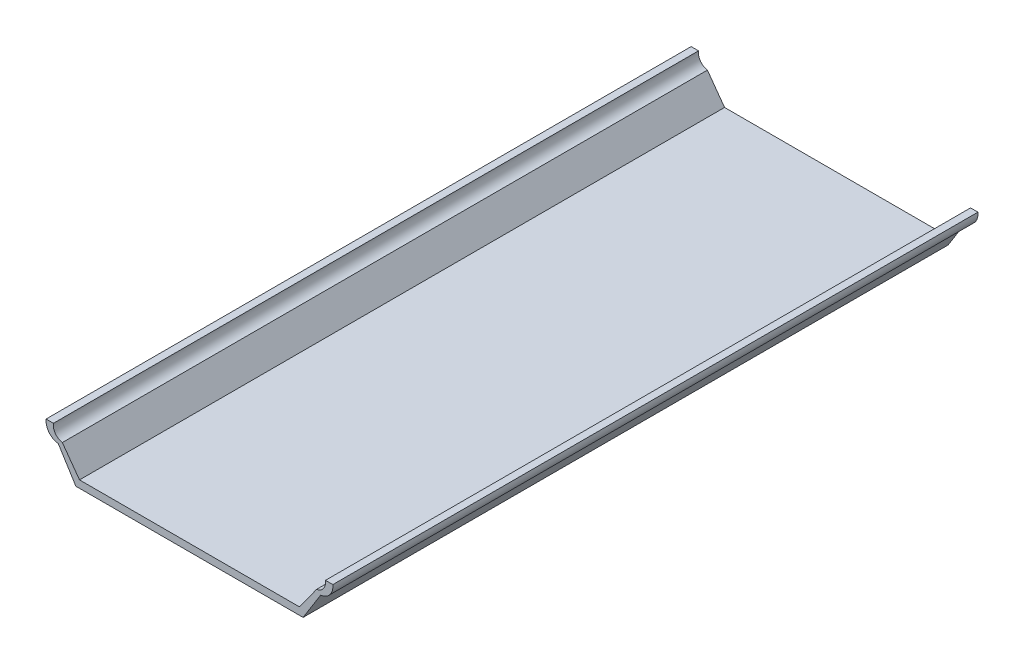
ISO-10303-21;
HEADER;
FILE_DESCRIPTION(('STEP AP214'),'2;1');
FILE_NAME('part.step','',(''),(''),'','','');
FILE_SCHEMA(('AUTOMOTIVE_DESIGN { 1 0 10303 214 1 1 1 1 }'));
ENDSEC;
DATA;
#1=APPLICATION_CONTEXT('core data for automotive mechanical design processes');
#2=APPLICATION_PROTOCOL_DEFINITION('international standard','automotive_design',2000,#1);
#3=PRODUCT_CONTEXT('',#1,'mechanical');
#4=PRODUCT('Part','Part','',(#3));
#5=PRODUCT_RELATED_PRODUCT_CATEGORY('part','',(#4));
#6=PRODUCT_DEFINITION_FORMATION('','',#4);
#7=PRODUCT_DEFINITION_CONTEXT('part definition',#1,'design');
#8=PRODUCT_DEFINITION('design','',#6,#7);
#9=PRODUCT_DEFINITION_SHAPE('','',#8);
#10=(LENGTH_UNIT() NAMED_UNIT(*) SI_UNIT(.MILLI.,.METRE.));
#11=(NAMED_UNIT(*) PLANE_ANGLE_UNIT() SI_UNIT($,.RADIAN.));
#12=(NAMED_UNIT(*) SI_UNIT($,.STERADIAN.) SOLID_ANGLE_UNIT());
#13=UNCERTAINTY_MEASURE_WITH_UNIT(LENGTH_MEASURE(1.E-05),#10,'distance_accuracy_value','');
#14=(GEOMETRIC_REPRESENTATION_CONTEXT(3) GLOBAL_UNCERTAINTY_ASSIGNED_CONTEXT((#13)) GLOBAL_UNIT_ASSIGNED_CONTEXT((#10,
#11,#12)) REPRESENTATION_CONTEXT('',''));
#15=CARTESIAN_POINT('',(0.,0.,0.));
#16=DIRECTION('',(0.,0.,1.));
#17=DIRECTION('',(1.,0.,0.));
#18=AXIS2_PLACEMENT_3D('',#15,#16,#17);
#19=CARTESIAN_POINT('',(17.6933296436668,4.70498395312144,88.));
#20=DIRECTION('',(0.,0.,-1.));
#21=DIRECTION('',(-1.,0.,0.));
#22=AXIS2_PLACEMENT_3D('',#19,#20,#21);
#23=CYLINDRICAL_SURFACE('',#22,1.87825051248784);
#24=CARTESIAN_POINT('',(17.6933296436668,4.70498395312144,0.));
#25=DIRECTION('',(0.,0.,1.));
#26=DIRECTION('',(1.,0.,0.));
#27=AXIS2_PLACEMENT_3D('',#24,#25,#26);
#28=CIRCLE('',#27,1.87825051248784);
#29=CARTESIAN_POINT('',(19.5600726634093,4.91257847593814,0.));
#30=VERTEX_POINT('',#29);
#31=CARTESIAN_POINT('',(17.9009241664836,2.83824093337895,0.));
#32=VERTEX_POINT('',#31);
#33=EDGE_CURVE('E152',#30,#32,#28,.F.);
#34=ORIENTED_EDGE('',*,*,#33,.F.);
#35=DIRECTION('',(0.,0.,-1.));
#36=VECTOR('',#35,1.);
#37=CARTESIAN_POINT('',(19.5600726634093,4.91257847593814,88.));
#38=LINE('',#37,#36);
#39=CARTESIAN_POINT('',(19.5600726634093,4.91257847593814,88.));
#40=VERTEX_POINT('',#39);
#41=EDGE_CURVE('E11',#40,#30,#38,.T.);
#42=ORIENTED_EDGE('',*,*,#41,.F.);
#43=CARTESIAN_POINT('',(17.6933296436668,4.70498395312144,88.));
#44=DIRECTION('',(0.,0.,1.));
#45=DIRECTION('',(1.,0.,0.));
#46=AXIS2_PLACEMENT_3D('',#43,#44,#45);
#47=CIRCLE('',#46,1.87825051248784);
#48=CARTESIAN_POINT('',(17.9009241664836,2.83824093337895,88.));
#49=VERTEX_POINT('',#48);
#50=EDGE_CURVE('E180',#40,#49,#47,.F.);
#51=ORIENTED_EDGE('',*,*,#50,.T.);
#52=DIRECTION('',(0.,0.,-1.));
#53=VECTOR('',#52,1.);
#54=CARTESIAN_POINT('',(17.9009241664836,2.83824093337895,88.));
#55=LINE('',#54,#53);
#56=EDGE_CURVE('E97',#49,#32,#55,.T.);
#57=ORIENTED_EDGE('',*,*,#56,.T.);
#58=EDGE_LOOP('',(#34,#42,#51,#57));
#59=FACE_BOUND('',#58,.T.);
#60=ADVANCED_FACE('F35',(#59),#23,.T.);
#61=CARTESIAN_POINT('',(0.,4.91257847593814,88.));
#62=DIRECTION('',(0.,1.,0.));
#63=DIRECTION('',(0.,0.,1.));
#64=AXIS2_PLACEMENT_3D('',#61,#62,#63);
#65=PLANE('',#64);
#66=DIRECTION('',(1.,0.,0.));
#67=VECTOR('',#66,1.);
#68=CARTESIAN_POINT('',(0.,4.91257847593814,0.));
#69=LINE('',#68,#67);
#70=CARTESIAN_POINT('',(18.5548578290723,4.91257847593814,0.));
#71=VERTEX_POINT('',#70);
#72=EDGE_CURVE('E155',#71,#30,#69,.T.);
#73=ORIENTED_EDGE('',*,*,#72,.F.);
#74=DIRECTION('',(0.,0.,-1.));
#75=VECTOR('',#74,1.);
#76=CARTESIAN_POINT('',(18.5548578290723,4.91257847593814,88.));
#77=LINE('',#76,#75);
#78=CARTESIAN_POINT('',(18.5548578290723,4.91257847593814,88.));
#79=VERTEX_POINT('',#78);
#80=EDGE_CURVE('E43',#79,#71,#77,.T.);
#81=ORIENTED_EDGE('',*,*,#80,.F.);
#82=DIRECTION('',(1.,0.,0.));
#83=VECTOR('',#82,1.);
#84=CARTESIAN_POINT('',(0.,4.91257847593814,88.));
#85=LINE('',#84,#83);
#86=EDGE_CURVE('E221',#79,#40,#85,.T.);
#87=ORIENTED_EDGE('',*,*,#86,.T.);
#88=ORIENTED_EDGE('',*,*,#41,.T.);
#89=EDGE_LOOP('',(#73,#81,#87,#88));
#90=FACE_BOUND('',#89,.T.);
#91=ADVANCED_FACE('F208',(#90),#65,.T.);
#92=CARTESIAN_POINT('',(17.1138925803951,4.68152527411039,88.));
#93=DIRECTION('',(0.,0.,-1.));
#94=DIRECTION('',(-1.,0.,0.));
#95=AXIS2_PLACEMENT_3D('',#92,#93,#94);
#96=CYLINDRICAL_SURFACE('',#95,1.45937192996519);
#97=CARTESIAN_POINT('',(17.1138925803951,4.68152527411039,0.));
#98=DIRECTION('',(0.,0.,1.));
#99=DIRECTION('',(1.,0.,0.));
#100=AXIS2_PLACEMENT_3D('',#97,#98,#99);
#101=CIRCLE('',#100,1.45937192996519);
#102=CARTESIAN_POINT('',(17.3449457822228,3.24056002543315,0.));
#103=VERTEX_POINT('',#102);
#104=EDGE_CURVE('E158',#103,#71,#101,.T.);
#105=ORIENTED_EDGE('',*,*,#104,.F.);
#106=DIRECTION('',(0.,0.,-1.));
#107=VECTOR('',#106,1.);
#108=CARTESIAN_POINT('',(17.3449457822228,3.24056002543315,88.));
#109=LINE('',#108,#107);
#110=CARTESIAN_POINT('',(17.3449457822228,3.24056002543315,88.));
#111=VERTEX_POINT('',#110);
#112=EDGE_CURVE('E197',#111,#103,#109,.T.);
#113=ORIENTED_EDGE('',*,*,#112,.F.);
#114=CARTESIAN_POINT('',(17.1138925803951,4.68152527411039,88.));
#115=DIRECTION('',(0.,0.,1.));
#116=DIRECTION('',(1.,0.,0.));
#117=AXIS2_PLACEMENT_3D('',#114,#115,#116);
#118=CIRCLE('',#117,1.45937192996519);
#119=EDGE_CURVE('E204',#111,#79,#118,.T.);
#120=ORIENTED_EDGE('',*,*,#119,.T.);
#121=ORIENTED_EDGE('',*,*,#80,.T.);
#122=EDGE_LOOP('',(#105,#113,#120,#121));
#123=FACE_BOUND('',#122,.T.);
#124=ADVANCED_FACE('F202',(#123),#96,.F.);
#125=CARTESIAN_POINT('',(9.84490244853307,-7.12400396594946,88.));
#126=DIRECTION('',(-0.810140006358287,0.586236445555712,0.));
#127=DIRECTION('',(-0.586236445555712,-0.810140006358287,0.));
#128=AXIS2_PLACEMENT_3D('',#125,#126,#127);
#129=PLANE('',#128);
#130=DIRECTION('',(0.586236445555712,0.810140006358287,0.));
#131=VECTOR('',#130,1.);
#132=CARTESIAN_POINT('',(9.84490244853307,-7.12400396594946,0.));
#133=LINE('',#132,#131);
#134=CARTESIAN_POINT('',(15.,0.,0.));
#135=VERTEX_POINT('',#134);
#136=EDGE_CURVE('E161',#135,#103,#133,.T.);
#137=ORIENTED_EDGE('',*,*,#136,.F.);
#138=DIRECTION('',(0.,0.,-1.));
#139=VECTOR('',#138,1.);
#140=CARTESIAN_POINT('',(15.,0.,88.));
#141=LINE('',#140,#139);
#142=CARTESIAN_POINT('',(15.,0.,88.));
#143=VERTEX_POINT('',#142);
#144=EDGE_CURVE('E195',#143,#135,#141,.T.);
#145=ORIENTED_EDGE('',*,*,#144,.F.);
#146=DIRECTION('',(0.586236445555712,0.810140006358287,0.));
#147=VECTOR('',#146,1.);
#148=CARTESIAN_POINT('',(9.84490244853307,-7.12400396594946,88.));
#149=LINE('',#148,#147);
#150=EDGE_CURVE('E218',#143,#111,#149,.T.);
#151=ORIENTED_EDGE('',*,*,#150,.T.);
#152=ORIENTED_EDGE('',*,*,#112,.T.);
#153=EDGE_LOOP('',(#137,#145,#151,#152));
#154=FACE_BOUND('',#153,.T.);
#155=ADVANCED_FACE('F215',(#154),#129,.T.);
#156=CARTESIAN_POINT('',(0.,0.,88.));
#157=DIRECTION('',(0.,1.,0.));
#158=DIRECTION('',(-1.,0.,0.));
#159=AXIS2_PLACEMENT_3D('',#156,#157,#158);
#160=PLANE('',#159);
#161=DIRECTION('',(1.,0.,0.));
#162=VECTOR('',#161,1.);
#163=CARTESIAN_POINT('',(0.,0.,0.));
#164=LINE('',#163,#162);
#165=CARTESIAN_POINT('',(-15.,0.,0.));
#166=VERTEX_POINT('',#165);
#167=EDGE_CURVE('E164',#166,#135,#164,.T.);
#168=ORIENTED_EDGE('',*,*,#167,.F.);
#169=DIRECTION('',(0.,0.,-1.));
#170=VECTOR('',#169,1.);
#171=CARTESIAN_POINT('',(-15.,0.,88.));
#172=LINE('',#171,#170);
#173=CARTESIAN_POINT('',(-15.,0.,88.));
#174=VERTEX_POINT('',#173);
#175=EDGE_CURVE('E193',#174,#166,#172,.T.);
#176=ORIENTED_EDGE('',*,*,#175,.F.);
#177=DIRECTION('',(1.,0.,0.));
#178=VECTOR('',#177,1.);
#179=CARTESIAN_POINT('',(0.,0.,88.));
#180=LINE('',#179,#178);
#181=EDGE_CURVE('E223',#174,#143,#180,.T.);
#182=ORIENTED_EDGE('',*,*,#181,.T.);
#183=ORIENTED_EDGE('',*,*,#144,.T.);
#184=EDGE_LOOP('',(#168,#176,#182,#183));
#185=FACE_BOUND('',#184,.T.);
#186=ADVANCED_FACE('F256',(#185),#160,.T.);
#187=CARTESIAN_POINT('',(-9.84490244853308,-7.12400396594946,88.));
#188=DIRECTION('',(-0.810140006358287,-0.586236445555712,0.));
#189=DIRECTION('',(0.586236445555712,-0.810140006358287,0.));
#190=AXIS2_PLACEMENT_3D('',#187,#188,#189);
#191=PLANE('',#190);
#192=DIRECTION('',(-0.586236445555712,0.810140006358287,0.));
#193=VECTOR('',#192,1.);
#194=CARTESIAN_POINT('',(-9.84490244853308,-7.12400396594946,0.));
#195=LINE('',#194,#193);
#196=CARTESIAN_POINT('',(-17.3449457822228,3.24056002543315,0.));
#197=VERTEX_POINT('',#196);
#198=EDGE_CURVE('E167',#166,#197,#195,.T.);
#199=ORIENTED_EDGE('',*,*,#198,.T.);
#200=DIRECTION('',(0.,0.,-1.));
#201=VECTOR('',#200,1.);
#202=CARTESIAN_POINT('',(-17.3449457822228,3.24056002543315,88.));
#203=LINE('',#202,#201);
#204=CARTESIAN_POINT('',(-17.3449457822228,3.24056002543315,88.));
#205=VERTEX_POINT('',#204);
#206=EDGE_CURVE('E190',#205,#197,#203,.T.);
#207=ORIENTED_EDGE('',*,*,#206,.F.);
#208=DIRECTION('',(-0.586236445555712,0.810140006358287,0.));
#209=VECTOR('',#208,1.);
#210=CARTESIAN_POINT('',(-9.84490244853308,-7.12400396594946,88.));
#211=LINE('',#210,#209);
#212=EDGE_CURVE('E229',#174,#205,#211,.T.);
#213=ORIENTED_EDGE('',*,*,#212,.F.);
#214=ORIENTED_EDGE('',*,*,#175,.T.);
#215=EDGE_LOOP('',(#199,#207,#213,#214));
#216=FACE_BOUND('',#215,.T.);
#217=ADVANCED_FACE('F259',(#216),#191,.F.);
#218=CARTESIAN_POINT('',(-17.1138925803951,4.68152527411039,88.));
#219=DIRECTION('',(0.,0.,-1.));
#220=DIRECTION('',(-1.,0.,0.));
#221=AXIS2_PLACEMENT_3D('',#218,#219,#220);
#222=CYLINDRICAL_SURFACE('',#221,1.45937192996519);
#223=CARTESIAN_POINT('',(-17.1138925803951,4.68152527411039,0.));
#224=DIRECTION('',(0.,0.,1.));
#225=DIRECTION('',(1.,0.,0.));
#226=AXIS2_PLACEMENT_3D('',#223,#224,#225);
#227=CIRCLE('',#226,1.45937192996519);
#228=CARTESIAN_POINT('',(-18.5548578290723,4.91257847593814,0.));
#229=VERTEX_POINT('',#228);
#230=EDGE_CURVE('E169',#197,#229,#227,.F.);
#231=ORIENTED_EDGE('',*,*,#230,.T.);
#232=DIRECTION('',(0.,0.,-1.));
#233=VECTOR('',#232,1.);
#234=CARTESIAN_POINT('',(-18.5548578290723,4.91257847593814,88.));
#235=LINE('',#234,#233);
#236=CARTESIAN_POINT('',(-18.5548578290723,4.91257847593814,88.));
#237=VERTEX_POINT('',#236);
#238=EDGE_CURVE('E187',#237,#229,#235,.T.);
#239=ORIENTED_EDGE('',*,*,#238,.F.);
#240=CARTESIAN_POINT('',(-17.1138925803951,4.68152527411039,88.));
#241=DIRECTION('',(0.,0.,1.));
#242=DIRECTION('',(1.,0.,0.));
#243=AXIS2_PLACEMENT_3D('',#240,#241,#242);
#244=CIRCLE('',#243,1.45937192996519);
#245=EDGE_CURVE('E231',#205,#237,#244,.F.);
#246=ORIENTED_EDGE('',*,*,#245,.F.);
#247=ORIENTED_EDGE('',*,*,#206,.T.);
#248=EDGE_LOOP('',(#231,#239,#246,#247));
#249=FACE_BOUND('',#248,.T.);
#250=ADVANCED_FACE('F263',(#249),#222,.F.);
#251=CARTESIAN_POINT('',(0.,4.91257847593815,88.));
#252=DIRECTION('',(0.,-1.,0.));
#253=DIRECTION('',(1.,0.,0.));
#254=AXIS2_PLACEMENT_3D('',#251,#252,#253);
#255=PLANE('',#254);
#256=DIRECTION('',(-1.,0.,0.));
#257=VECTOR('',#256,1.);
#258=CARTESIAN_POINT('',(0.,4.91257847593815,0.));
#259=LINE('',#258,#257);
#260=CARTESIAN_POINT('',(-19.5600726634093,4.91257847593814,0.));
#261=VERTEX_POINT('',#260);
#262=EDGE_CURVE('E171',#229,#261,#259,.T.);
#263=ORIENTED_EDGE('',*,*,#262,.T.);
#264=DIRECTION('',(0.,0.,-1.));
#265=VECTOR('',#264,1.);
#266=CARTESIAN_POINT('',(-19.5600726634093,4.91257847593814,88.));
#267=LINE('',#266,#265);
#268=CARTESIAN_POINT('',(-19.5600726634093,4.91257847593814,88.));
#269=VERTEX_POINT('',#268);
#270=EDGE_CURVE('E184',#269,#261,#267,.T.);
#271=ORIENTED_EDGE('',*,*,#270,.F.);
#272=DIRECTION('',(-1.,0.,0.));
#273=VECTOR('',#272,1.);
#274=CARTESIAN_POINT('',(0.,4.91257847593815,88.));
#275=LINE('',#274,#273);
#276=EDGE_CURVE('E147',#237,#269,#275,.T.);
#277=ORIENTED_EDGE('',*,*,#276,.F.);
#278=ORIENTED_EDGE('',*,*,#238,.T.);
#279=EDGE_LOOP('',(#263,#271,#277,#278));
#280=FACE_BOUND('',#279,.T.);
#281=ADVANCED_FACE('F237',(#280),#255,.F.);
#282=CARTESIAN_POINT('',(-17.6933296436668,4.70498395312144,88.));
#283=DIRECTION('',(0.,0.,-1.));
#284=DIRECTION('',(-1.,0.,0.));
#285=AXIS2_PLACEMENT_3D('',#282,#283,#284);
#286=CYLINDRICAL_SURFACE('',#285,1.87825051248784);
#287=CARTESIAN_POINT('',(-17.6933296436668,4.70498395312144,0.));
#288=DIRECTION('',(0.,0.,1.));
#289=DIRECTION('',(1.,0.,0.));
#290=AXIS2_PLACEMENT_3D('',#287,#288,#289);
#291=CIRCLE('',#290,1.87825051248784);
#292=CARTESIAN_POINT('',(-17.9009241664836,2.83824093337895,0.));
#293=VERTEX_POINT('',#292);
#294=EDGE_CURVE('E173',#261,#293,#291,.T.);
#295=ORIENTED_EDGE('',*,*,#294,.T.);
#296=DIRECTION('',(0.,0.,-1.));
#297=VECTOR('',#296,1.);
#298=CARTESIAN_POINT('',(-17.9009241664836,2.83824093337895,88.));
#299=LINE('',#298,#297);
#300=CARTESIAN_POINT('',(-17.9009241664836,2.83824093337895,88.));
#301=VERTEX_POINT('',#300);
#302=EDGE_CURVE('E136',#301,#293,#299,.T.);
#303=ORIENTED_EDGE('',*,*,#302,.F.);
#304=CARTESIAN_POINT('',(-17.6933296436668,4.70498395312144,88.));
#305=DIRECTION('',(0.,0.,1.));
#306=DIRECTION('',(1.,0.,0.));
#307=AXIS2_PLACEMENT_3D('',#304,#305,#306);
#308=CIRCLE('',#307,1.87825051248784);
#309=EDGE_CURVE('E144',#269,#301,#308,.T.);
#310=ORIENTED_EDGE('',*,*,#309,.F.);
#311=ORIENTED_EDGE('',*,*,#270,.T.);
#312=EDGE_LOOP('',(#295,#303,#310,#311));
#313=FACE_BOUND('',#312,.T.);
#314=ADVANCED_FACE('F241',(#313),#286,.T.);
#315=CARTESIAN_POINT('',(-11.5903897110384,-7.2501042115919,88.));
#316=DIRECTION('',(-0.847797356541996,-0.530320320410602,0.));
#317=DIRECTION('',(0.530320320410602,-0.847797356541996,0.));
#318=AXIS2_PLACEMENT_3D('',#315,#316,#317);
#319=PLANE('',#318);
#320=DIRECTION('',(-0.530320320410602,0.847797356541996,0.));
#321=VECTOR('',#320,1.);
#322=CARTESIAN_POINT('',(-11.5903897110384,-7.2501042115919,0.));
#323=LINE('',#322,#321);
#324=CARTESIAN_POINT('',(-15.5,-1.,0.));
#325=VERTEX_POINT('',#324);
#326=EDGE_CURVE('E135',#325,#293,#323,.T.);
#327=ORIENTED_EDGE('',*,*,#326,.F.);
#328=DIRECTION('',(0.,0.,-1.));
#329=VECTOR('',#328,1.);
#330=CARTESIAN_POINT('',(-15.5,-1.,88.));
#331=LINE('',#330,#329);
#332=CARTESIAN_POINT('',(-15.5,-1.,88.));
#333=VERTEX_POINT('',#332);
#334=EDGE_CURVE('E129',#333,#325,#331,.T.);
#335=ORIENTED_EDGE('',*,*,#334,.F.);
#336=DIRECTION('',(-0.530320320410602,0.847797356541996,0.));
#337=VECTOR('',#336,1.);
#338=CARTESIAN_POINT('',(-11.5903897110384,-7.2501042115919,88.));
#339=LINE('',#338,#337);
#340=EDGE_CURVE('E133',#333,#301,#339,.T.);
#341=ORIENTED_EDGE('',*,*,#340,.T.);
#342=ORIENTED_EDGE('',*,*,#302,.T.);
#343=EDGE_LOOP('',(#327,#335,#341,#342));
#344=FACE_BOUND('',#343,.T.);
#345=ADVANCED_FACE('F131',(#344),#319,.T.);
#346=CARTESIAN_POINT('',(0.,-0.999999999999997,88.));
#347=DIRECTION('',(0.,1.,0.));
#348=DIRECTION('',(-1.,0.,0.));
#349=AXIS2_PLACEMENT_3D('',#346,#347,#348);
#350=PLANE('',#349);
#351=DIRECTION('',(1.,0.,0.));
#352=VECTOR('',#351,1.);
#353=CARTESIAN_POINT('',(0.,-0.999999999999997,0.));
#354=LINE('',#353,#352);
#355=CARTESIAN_POINT('',(15.5,-0.999999999999994,0.));
#356=VERTEX_POINT('',#355);
#357=EDGE_CURVE('E90',#325,#356,#354,.T.);
#358=ORIENTED_EDGE('',*,*,#357,.T.);
#359=DIRECTION('',(0.,0.,-1.));
#360=VECTOR('',#359,1.);
#361=CARTESIAN_POINT('',(15.5,-0.999999999999994,88.));
#362=LINE('',#361,#360);
#363=CARTESIAN_POINT('',(15.5,-0.999999999999994,88.));
#364=VERTEX_POINT('',#363);
#365=EDGE_CURVE('E137',#364,#356,#362,.T.);
#366=ORIENTED_EDGE('',*,*,#365,.F.);
#367=DIRECTION('',(1.,0.,0.));
#368=VECTOR('',#367,1.);
#369=CARTESIAN_POINT('',(0.,-0.999999999999997,88.));
#370=LINE('',#369,#368);
#371=EDGE_CURVE('E139',#333,#364,#370,.T.);
#372=ORIENTED_EDGE('',*,*,#371,.F.);
#373=ORIENTED_EDGE('',*,*,#334,.T.);
#374=EDGE_LOOP('',(#358,#366,#372,#373));
#375=FACE_BOUND('',#374,.T.);
#376=ADVANCED_FACE('F140',(#375),#350,.F.);
#377=CARTESIAN_POINT('',(11.5903897110384,-7.2501042115919,88.));
#378=DIRECTION('',(-0.847797356541996,0.530320320410602,0.));
#379=DIRECTION('',(-0.530320320410602,-0.847797356541996,0.));
#380=AXIS2_PLACEMENT_3D('',#377,#378,#379);
#381=PLANE('',#380);
#382=DIRECTION('',(0.530320320410602,0.847797356541996,0.));
#383=VECTOR('',#382,1.);
#384=CARTESIAN_POINT('',(11.5903897110384,-7.2501042115919,0.));
#385=LINE('',#384,#383);
#386=EDGE_CURVE('E178',#356,#32,#385,.T.);
#387=ORIENTED_EDGE('',*,*,#386,.T.);
#388=ORIENTED_EDGE('',*,*,#56,.F.);
#389=DIRECTION('',(0.530320320410602,0.847797356541996,0.));
#390=VECTOR('',#389,1.);
#391=CARTESIAN_POINT('',(11.5903897110384,-7.2501042115919,88.));
#392=LINE('',#391,#390);
#393=EDGE_CURVE('E51',#364,#49,#392,.T.);
#394=ORIENTED_EDGE('',*,*,#393,.F.);
#395=ORIENTED_EDGE('',*,*,#365,.T.);
#396=EDGE_LOOP('',(#387,#388,#394,#395));
#397=FACE_BOUND('',#396,.T.);
#398=ADVANCED_FACE('F244',(#397),#381,.F.);
#399=CARTESIAN_POINT('',(0.,0.,88.));
#400=DIRECTION('',(0.,0.,1.));
#401=DIRECTION('',(1.,0.,0.));
#402=AXIS2_PLACEMENT_3D('',#399,#400,#401);
#403=PLANE('',#402);
#404=ORIENTED_EDGE('',*,*,#50,.F.);
#405=ORIENTED_EDGE('',*,*,#86,.F.);
#406=ORIENTED_EDGE('',*,*,#119,.F.);
#407=ORIENTED_EDGE('',*,*,#150,.F.);
#408=ORIENTED_EDGE('',*,*,#181,.F.);
#409=ORIENTED_EDGE('',*,*,#212,.T.);
#410=ORIENTED_EDGE('',*,*,#245,.T.);
#411=ORIENTED_EDGE('',*,*,#276,.T.);
#412=ORIENTED_EDGE('',*,*,#309,.T.);
#413=ORIENTED_EDGE('',*,*,#340,.F.);
#414=ORIENTED_EDGE('',*,*,#371,.T.);
#415=ORIENTED_EDGE('',*,*,#393,.T.);
#416=EDGE_LOOP('',(#404,#405,#406,#407,#408,#409,#410,#411,#412,#413,#414,#415));
#417=FACE_BOUND('',#416,.T.);
#418=ADVANCED_FACE('F142',(#417),#403,.T.);
#419=CARTESIAN_POINT('',(0.,0.,0.));
#420=DIRECTION('',(0.,0.,1.));
#421=DIRECTION('',(1.,0.,0.));
#422=AXIS2_PLACEMENT_3D('',#419,#420,#421);
#423=PLANE('',#422);
#424=ORIENTED_EDGE('',*,*,#33,.T.);
#425=ORIENTED_EDGE('',*,*,#386,.F.);
#426=ORIENTED_EDGE('',*,*,#357,.F.);
#427=ORIENTED_EDGE('',*,*,#326,.T.);
#428=ORIENTED_EDGE('',*,*,#294,.F.);
#429=ORIENTED_EDGE('',*,*,#262,.F.);
#430=ORIENTED_EDGE('',*,*,#230,.F.);
#431=ORIENTED_EDGE('',*,*,#198,.F.);
#432=ORIENTED_EDGE('',*,*,#167,.T.);
#433=ORIENTED_EDGE('',*,*,#136,.T.);
#434=ORIENTED_EDGE('',*,*,#104,.T.);
#435=ORIENTED_EDGE('',*,*,#72,.T.);
#436=EDGE_LOOP('',(#424,#425,#426,#427,#428,#429,#430,#431,#432,#433,#434,#435));
#437=FACE_BOUND('',#436,.T.);
#438=ADVANCED_FACE('F210',(#437),#423,.F.);
#439=CLOSED_SHELL('',(#60,#91,#124,#155,#186,#217,#250,#281,#314,#345,#376,#398,#418,#438));
#440=MANIFOLD_SOLID_BREP('B2',#439);
#441=ADVANCED_BREP_SHAPE_REPRESENTATION('',(#18,#440),#14);
#442=SHAPE_DEFINITION_REPRESENTATION(#9,#441);
ENDSEC;
END-ISO-10303-21;
